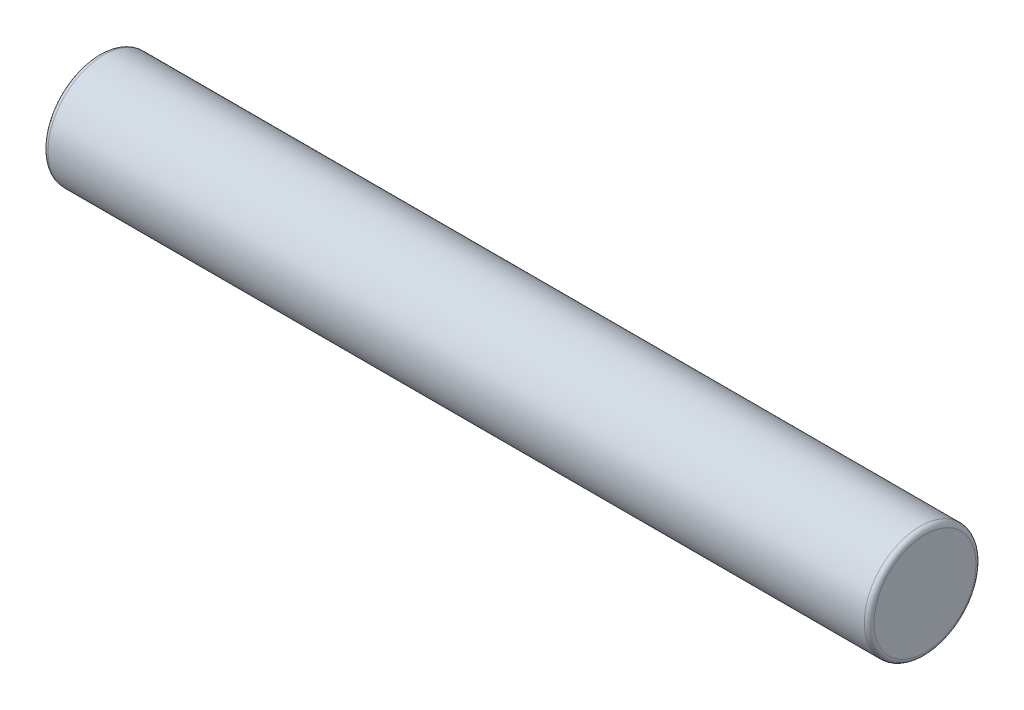
ISO-10303-21;
HEADER;
FILE_DESCRIPTION(('STEP AP214'),'2;1');
FILE_NAME('part.step','',(''),(''),'','','');
FILE_SCHEMA(('AUTOMOTIVE_DESIGN { 1 0 10303 214 1 1 1 1 }'));
ENDSEC;
DATA;
#1=APPLICATION_CONTEXT('core data for automotive mechanical design processes');
#2=APPLICATION_PROTOCOL_DEFINITION('international standard','automotive_design',2000,#1);
#3=PRODUCT_CONTEXT('',#1,'mechanical');
#4=PRODUCT('Part','Part','',(#3));
#5=PRODUCT_RELATED_PRODUCT_CATEGORY('part','',(#4));
#6=PRODUCT_DEFINITION_FORMATION('','',#4);
#7=PRODUCT_DEFINITION_CONTEXT('part definition',#1,'design');
#8=PRODUCT_DEFINITION('design','',#6,#7);
#9=PRODUCT_DEFINITION_SHAPE('','',#8);
#10=(LENGTH_UNIT() NAMED_UNIT(*) SI_UNIT(.MILLI.,.METRE.));
#11=(NAMED_UNIT(*) PLANE_ANGLE_UNIT() SI_UNIT($,.RADIAN.));
#12=(NAMED_UNIT(*) SI_UNIT($,.STERADIAN.) SOLID_ANGLE_UNIT());
#13=UNCERTAINTY_MEASURE_WITH_UNIT(LENGTH_MEASURE(1.E-05),#10,'distance_accuracy_value','');
#14=(GEOMETRIC_REPRESENTATION_CONTEXT(3) GLOBAL_UNCERTAINTY_ASSIGNED_CONTEXT((#13)) GLOBAL_UNIT_ASSIGNED_CONTEXT((#10,
#11,#12)) REPRESENTATION_CONTEXT('',''));
#15=CARTESIAN_POINT('',(0.,0.,0.));
#16=DIRECTION('',(0.,0.,1.));
#17=DIRECTION('',(1.,0.,0.));
#18=AXIS2_PLACEMENT_3D('',#15,#16,#17);
#19=CARTESIAN_POINT('',(8.5,0.,0.));
#20=DIRECTION('',(-1.,0.,0.));
#21=DIRECTION('',(0.,0.,1.));
#22=AXIS2_PLACEMENT_3D('',#19,#20,#21);
#23=CYLINDRICAL_SURFACE('',#22,1.15);
#24=CARTESIAN_POINT('',(-8.4,0.,0.));
#25=DIRECTION('',(1.,0.,0.));
#26=DIRECTION('',(0.,0.,-1.));
#27=AXIS2_PLACEMENT_3D('',#24,#25,#26);
#28=CIRCLE('',#27,1.15);
#29=CARTESIAN_POINT('',(-8.4,0.,-1.15));
#30=VERTEX_POINT('',#29);
#31=EDGE_CURVE('E42',#30,#30,#28,.T.);
#32=ORIENTED_EDGE('',*,*,#31,.T.);
#33=EDGE_LOOP('',(#32));
#34=FACE_BOUND('',#33,.T.);
#35=CARTESIAN_POINT('',(8.4,0.,0.));
#36=DIRECTION('',(1.,0.,0.));
#37=DIRECTION('',(0.,0.,-1.));
#38=AXIS2_PLACEMENT_3D('',#35,#36,#37);
#39=CIRCLE('',#38,1.15);
#40=CARTESIAN_POINT('',(8.4,0.,-1.15));
#41=VERTEX_POINT('',#40);
#42=EDGE_CURVE('E46',#41,#41,#39,.F.);
#43=ORIENTED_EDGE('',*,*,#42,.T.);
#44=EDGE_LOOP('',(#43));
#45=FACE_BOUND('',#44,.T.);
#46=ADVANCED_FACE('F31',(#34,#45),#23,.T.);
#47=CARTESIAN_POINT('',(8.5,0.,0.));
#48=DIRECTION('',(1.,0.,0.));
#49=DIRECTION('',(0.,0.,-1.));
#50=AXIS2_PLACEMENT_3D('',#47,#48,#49);
#51=PLANE('',#50);
#52=CARTESIAN_POINT('',(8.5,0.,0.));
#53=DIRECTION('',(1.,0.,0.));
#54=DIRECTION('',(0.,0.,-1.));
#55=AXIS2_PLACEMENT_3D('',#52,#53,#54);
#56=CIRCLE('',#55,1.05);
#57=CARTESIAN_POINT('',(8.5,0.,-1.05));
#58=VERTEX_POINT('',#57);
#59=EDGE_CURVE('E10',#58,#58,#56,.T.);
#60=ORIENTED_EDGE('',*,*,#59,.T.);
#61=EDGE_LOOP('',(#60));
#62=FACE_BOUND('',#61,.T.);
#63=ADVANCED_FACE('F62',(#62),#51,.T.);
#64=CARTESIAN_POINT('',(-8.5,0.,0.));
#65=DIRECTION('',(1.,0.,0.));
#66=DIRECTION('',(0.,0.,-1.));
#67=AXIS2_PLACEMENT_3D('',#64,#65,#66);
#68=PLANE('',#67);
#69=CARTESIAN_POINT('',(-8.5,0.,0.));
#70=DIRECTION('',(1.,0.,0.));
#71=DIRECTION('',(0.,0.,-1.));
#72=AXIS2_PLACEMENT_3D('',#69,#70,#71);
#73=CIRCLE('',#72,1.05);
#74=CARTESIAN_POINT('',(-8.5,0.,-1.05));
#75=VERTEX_POINT('',#74);
#76=EDGE_CURVE('E38',#75,#75,#73,.F.);
#77=ORIENTED_EDGE('',*,*,#76,.T.);
#78=EDGE_LOOP('',(#77));
#79=FACE_BOUND('',#78,.T.);
#80=ADVANCED_FACE('F59',(#79),#68,.F.);
#81=CARTESIAN_POINT('',(-8.4,0.,0.));
#82=DIRECTION('',(1.,0.,0.));
#83=DIRECTION('',(0.,0.,-1.));
#84=AXIS2_PLACEMENT_3D('',#81,#82,#83);
#85=TOROIDAL_SURFACE('',#84,1.05,0.1);
#86=ORIENTED_EDGE('',*,*,#76,.F.);
#87=EDGE_LOOP('',(#86));
#88=FACE_BOUND('',#87,.T.);
#89=ORIENTED_EDGE('',*,*,#31,.F.);
#90=EDGE_LOOP('',(#89));
#91=FACE_BOUND('',#90,.T.);
#92=ADVANCED_FACE('F55',(#88,#91),#85,.T.);
#93=CARTESIAN_POINT('',(8.4,0.,0.));
#94=DIRECTION('',(1.,0.,0.));
#95=DIRECTION('',(0.,0.,-1.));
#96=AXIS2_PLACEMENT_3D('',#93,#94,#95);
#97=TOROIDAL_SURFACE('',#96,1.05,0.1);
#98=ORIENTED_EDGE('',*,*,#42,.F.);
#99=EDGE_LOOP('',(#98));
#100=FACE_BOUND('',#99,.T.);
#101=ORIENTED_EDGE('',*,*,#59,.F.);
#102=EDGE_LOOP('',(#101));
#103=FACE_BOUND('',#102,.T.);
#104=ADVANCED_FACE('F33',(#100,#103),#97,.T.);
#105=CLOSED_SHELL('',(#46,#63,#80,#92,#104));
#106=MANIFOLD_SOLID_BREP('B2',#105);
#107=ADVANCED_BREP_SHAPE_REPRESENTATION('',(#18,#106),#14);
#108=SHAPE_DEFINITION_REPRESENTATION(#9,#107);
ENDSEC;
END-ISO-10303-21;
